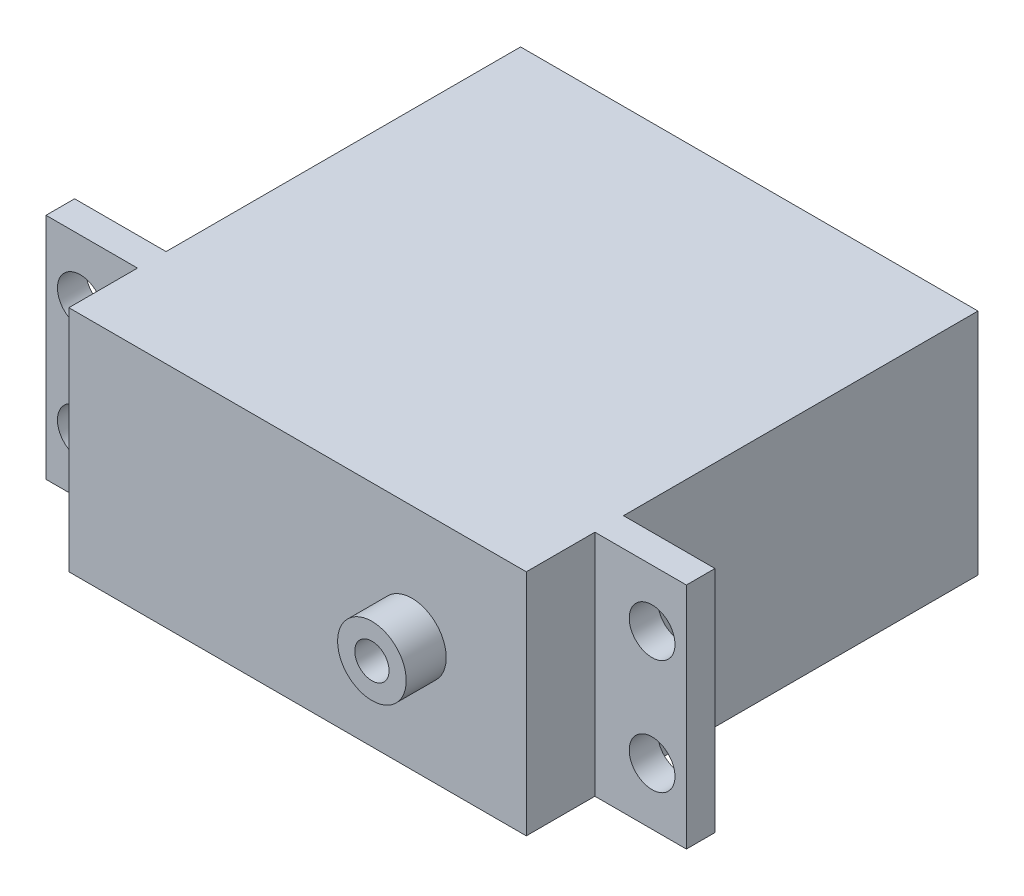
ISO-10303-21;
HEADER;
FILE_DESCRIPTION(('STEP AP214'),'2;1');
FILE_NAME('part.step','',(''),(''),'','','');
FILE_SCHEMA(('AUTOMOTIVE_DESIGN { 1 0 10303 214 1 1 1 1 }'));
ENDSEC;
DATA;
#1=APPLICATION_CONTEXT('core data for automotive mechanical design processes');
#2=APPLICATION_PROTOCOL_DEFINITION('international standard','automotive_design',2000,#1);
#3=PRODUCT_CONTEXT('',#1,'mechanical');
#4=PRODUCT('Part','Part','',(#3));
#5=PRODUCT_RELATED_PRODUCT_CATEGORY('part','',(#4));
#6=PRODUCT_DEFINITION_FORMATION('','',#4);
#7=PRODUCT_DEFINITION_CONTEXT('part definition',#1,'design');
#8=PRODUCT_DEFINITION('design','',#6,#7);
#9=PRODUCT_DEFINITION_SHAPE('','',#8);
#10=(LENGTH_UNIT() NAMED_UNIT(*) SI_UNIT(.MILLI.,.METRE.));
#11=(NAMED_UNIT(*) PLANE_ANGLE_UNIT() SI_UNIT($,.RADIAN.));
#12=(NAMED_UNIT(*) SI_UNIT($,.STERADIAN.) SOLID_ANGLE_UNIT());
#13=UNCERTAINTY_MEASURE_WITH_UNIT(LENGTH_MEASURE(1.E-05),#10,'distance_accuracy_value','');
#14=(GEOMETRIC_REPRESENTATION_CONTEXT(3) GLOBAL_UNCERTAINTY_ASSIGNED_CONTEXT((#13)) GLOBAL_UNIT_ASSIGNED_CONTEXT((#10,
#11,#12)) REPRESENTATION_CONTEXT('',''));
#15=CARTESIAN_POINT('',(0.,0.,0.));
#16=DIRECTION('',(0.,0.,1.));
#17=DIRECTION('',(1.,0.,0.));
#18=AXIS2_PLACEMENT_3D('',#15,#16,#17);
#19=CARTESIAN_POINT('',(20.,-10.,39.5));
#20=DIRECTION('',(-1.,0.,0.));
#21=DIRECTION('',(0.,0.,1.));
#22=AXIS2_PLACEMENT_3D('',#19,#20,#21);
#23=PLANE('',#22);
#24=DIRECTION('',(0.,-1.,0.));
#25=VECTOR('',#24,1.);
#26=CARTESIAN_POINT('',(20.,-10.,33.5));
#27=LINE('',#26,#25);
#28=CARTESIAN_POINT('',(20.,10.,33.5));
#29=VERTEX_POINT('',#28);
#30=CARTESIAN_POINT('',(20.,-10.,33.5));
#31=VERTEX_POINT('',#30);
#32=EDGE_CURVE('E59',#29,#31,#27,.T.);
#33=ORIENTED_EDGE('',*,*,#32,.F.);
#34=DIRECTION('',(0.,0.,-1.));
#35=VECTOR('',#34,1.);
#36=CARTESIAN_POINT('',(20.,10.,39.5));
#37=LINE('',#36,#35);
#38=CARTESIAN_POINT('',(20.,10.,39.5));
#39=VERTEX_POINT('',#38);
#40=EDGE_CURVE('E44',#39,#29,#37,.T.);
#41=ORIENTED_EDGE('',*,*,#40,.F.);
#42=DIRECTION('',(0.,1.,0.));
#43=VECTOR('',#42,1.);
#44=CARTESIAN_POINT('',(20.,-10.,39.5));
#45=LINE('',#44,#43);
#46=CARTESIAN_POINT('',(20.,-10.,39.5));
#47=VERTEX_POINT('',#46);
#48=EDGE_CURVE('E197',#47,#39,#45,.T.);
#49=ORIENTED_EDGE('',*,*,#48,.F.);
#50=DIRECTION('',(0.,0.,-1.));
#51=VECTOR('',#50,1.);
#52=CARTESIAN_POINT('',(20.,-10.,39.5));
#53=LINE('',#52,#51);
#54=EDGE_CURVE('E217',#47,#31,#53,.T.);
#55=ORIENTED_EDGE('',*,*,#54,.T.);
#56=EDGE_LOOP('',(#33,#41,#49,#55));
#57=FACE_BOUND('',#56,.T.);
#58=ADVANCED_FACE('F36',(#57),#23,.F.);
#59=CARTESIAN_POINT('',(-20.,-10.,39.5));
#60=DIRECTION('',(1.,0.,0.));
#61=DIRECTION('',(0.,0.,-1.));
#62=AXIS2_PLACEMENT_3D('',#59,#60,#61);
#63=PLANE('',#62);
#64=DIRECTION('',(0.,1.,0.));
#65=VECTOR('',#64,1.);
#66=CARTESIAN_POINT('',(-20.,-10.,33.5));
#67=LINE('',#66,#65);
#68=CARTESIAN_POINT('',(-20.,-10.,33.5));
#69=VERTEX_POINT('',#68);
#70=CARTESIAN_POINT('',(-20.,10.,33.5));
#71=VERTEX_POINT('',#70);
#72=EDGE_CURVE('E176',#69,#71,#67,.T.);
#73=ORIENTED_EDGE('',*,*,#72,.F.);
#74=DIRECTION('',(0.,0.,-1.));
#75=VECTOR('',#74,1.);
#76=CARTESIAN_POINT('',(-20.,-10.,39.5));
#77=LINE('',#76,#75);
#78=CARTESIAN_POINT('',(-20.,-10.,39.5));
#79=VERTEX_POINT('',#78);
#80=EDGE_CURVE('E220',#79,#69,#77,.T.);
#81=ORIENTED_EDGE('',*,*,#80,.F.);
#82=DIRECTION('',(0.,-1.,0.));
#83=VECTOR('',#82,1.);
#84=CARTESIAN_POINT('',(-20.,-10.,39.5));
#85=LINE('',#84,#83);
#86=CARTESIAN_POINT('',(-20.,10.,39.5));
#87=VERTEX_POINT('',#86);
#88=EDGE_CURVE('E203',#87,#79,#85,.T.);
#89=ORIENTED_EDGE('',*,*,#88,.F.);
#90=DIRECTION('',(0.,0.,-1.));
#91=VECTOR('',#90,1.);
#92=CARTESIAN_POINT('',(-20.,10.,39.5));
#93=LINE('',#92,#91);
#94=EDGE_CURVE('E224',#87,#71,#93,.T.);
#95=ORIENTED_EDGE('',*,*,#94,.T.);
#96=EDGE_LOOP('',(#73,#81,#89,#95));
#97=FACE_BOUND('',#96,.T.);
#98=ADVANCED_FACE('F254',(#97),#63,.F.);
#99=CARTESIAN_POINT('',(20.,10.,31.));
#100=VERTEX_POINT('',#99);
#101=CARTESIAN_POINT('',(20.,10.,0.));
#102=VERTEX_POINT('',#101);
#103=EDGE_CURVE('E51',#100,#102,#37,.T.);
#104=ORIENTED_EDGE('',*,*,#103,.F.);
#105=DIRECTION('',(0.,-1.,0.));
#106=VECTOR('',#105,1.);
#107=CARTESIAN_POINT('',(20.,-10.,31.));
#108=LINE('',#107,#106);
#109=CARTESIAN_POINT('',(20.,-10.,31.));
#110=VERTEX_POINT('',#109);
#111=EDGE_CURVE('E145',#100,#110,#108,.T.);
#112=ORIENTED_EDGE('',*,*,#111,.T.);
#113=CARTESIAN_POINT('',(20.,-10.,0.));
#114=VERTEX_POINT('',#113);
#115=EDGE_CURVE('E207',#110,#114,#53,.T.);
#116=ORIENTED_EDGE('',*,*,#115,.T.);
#117=DIRECTION('',(0.,1.,0.));
#118=VECTOR('',#117,1.);
#119=CARTESIAN_POINT('',(20.,-10.,0.));
#120=LINE('',#119,#118);
#121=EDGE_CURVE('E196',#114,#102,#120,.T.);
#122=ORIENTED_EDGE('',*,*,#121,.T.);
#123=EDGE_LOOP('',(#104,#112,#116,#122));
#124=FACE_BOUND('',#123,.T.);
#125=ADVANCED_FACE('F38',(#124),#23,.F.);
#126=CARTESIAN_POINT('',(-20.,10.,39.5));
#127=DIRECTION('',(0.,-1.,0.));
#128=DIRECTION('',(0.,0.,-1.));
#129=AXIS2_PLACEMENT_3D('',#126,#127,#128);
#130=PLANE('',#129);
#131=CARTESIAN_POINT('',(-20.,10.,31.));
#132=VERTEX_POINT('',#131);
#133=CARTESIAN_POINT('',(-20.,10.,0.));
#134=VERTEX_POINT('',#133);
#135=EDGE_CURVE('E223',#132,#134,#93,.T.);
#136=ORIENTED_EDGE('',*,*,#135,.F.);
#137=DIRECTION('',(-1.,0.,0.));
#138=VECTOR('',#137,1.);
#139=CARTESIAN_POINT('',(-28.,10.,31.));
#140=LINE('',#139,#138);
#141=CARTESIAN_POINT('',(-28.,10.,31.));
#142=VERTEX_POINT('',#141);
#143=EDGE_CURVE('E147',#132,#142,#140,.T.);
#144=ORIENTED_EDGE('',*,*,#143,.T.);
#145=DIRECTION('',(0.,0.,1.));
#146=VECTOR('',#145,1.);
#147=CARTESIAN_POINT('',(-28.,10.,31.));
#148=LINE('',#147,#146);
#149=CARTESIAN_POINT('',(-28.,10.,33.5));
#150=VERTEX_POINT('',#149);
#151=EDGE_CURVE('E137',#142,#150,#148,.T.);
#152=ORIENTED_EDGE('',*,*,#151,.T.);
#153=DIRECTION('',(-1.,0.,0.));
#154=VECTOR('',#153,1.);
#155=CARTESIAN_POINT('',(-28.,10.,33.5));
#156=LINE('',#155,#154);
#157=EDGE_CURVE('E169',#71,#150,#156,.T.);
#158=ORIENTED_EDGE('',*,*,#157,.F.);
#159=ORIENTED_EDGE('',*,*,#94,.F.);
#160=DIRECTION('',(-1.,0.,0.));
#161=VECTOR('',#160,1.);
#162=CARTESIAN_POINT('',(-20.,10.,39.5));
#163=LINE('',#162,#161);
#164=EDGE_CURVE('E200',#39,#87,#163,.T.);
#165=ORIENTED_EDGE('',*,*,#164,.F.);
#166=ORIENTED_EDGE('',*,*,#40,.T.);
#167=CARTESIAN_POINT('',(28.,10.,33.5));
#168=VERTEX_POINT('',#167);
#169=EDGE_CURVE('E132',#168,#29,#156,.T.);
#170=ORIENTED_EDGE('',*,*,#169,.F.);
#171=DIRECTION('',(0.,0.,1.));
#172=VECTOR('',#171,1.);
#173=CARTESIAN_POINT('',(28.,10.,31.));
#174=LINE('',#173,#172);
#175=CARTESIAN_POINT('',(28.,10.,31.));
#176=VERTEX_POINT('',#175);
#177=EDGE_CURVE('E126',#176,#168,#174,.T.);
#178=ORIENTED_EDGE('',*,*,#177,.F.);
#179=EDGE_CURVE('E130',#176,#100,#140,.T.);
#180=ORIENTED_EDGE('',*,*,#179,.T.);
#181=ORIENTED_EDGE('',*,*,#103,.T.);
#182=DIRECTION('',(-1.,0.,0.));
#183=VECTOR('',#182,1.);
#184=CARTESIAN_POINT('',(-20.,10.,0.));
#185=LINE('',#184,#183);
#186=EDGE_CURVE('E209',#102,#134,#185,.T.);
#187=ORIENTED_EDGE('',*,*,#186,.T.);
#188=EDGE_LOOP('',(#136,#144,#152,#158,#159,#165,#166,#170,#178,#180,#181,#187));
#189=FACE_BOUND('',#188,.T.);
#190=ADVANCED_FACE('F129',(#189),#130,.F.);
#191=CARTESIAN_POINT('',(-20.,-10.,31.));
#192=VERTEX_POINT('',#191);
#193=CARTESIAN_POINT('',(-20.,-10.,0.));
#194=VERTEX_POINT('',#193);
#195=EDGE_CURVE('E219',#192,#194,#77,.T.);
#196=ORIENTED_EDGE('',*,*,#195,.F.);
#197=DIRECTION('',(0.,1.,0.));
#198=VECTOR('',#197,1.);
#199=CARTESIAN_POINT('',(-20.,-10.,31.));
#200=LINE('',#199,#198);
#201=EDGE_CURVE('E184',#192,#132,#200,.T.);
#202=ORIENTED_EDGE('',*,*,#201,.T.);
#203=ORIENTED_EDGE('',*,*,#135,.T.);
#204=DIRECTION('',(0.,-1.,0.));
#205=VECTOR('',#204,1.);
#206=CARTESIAN_POINT('',(-20.,-10.,0.));
#207=LINE('',#206,#205);
#208=EDGE_CURVE('E212',#134,#194,#207,.T.);
#209=ORIENTED_EDGE('',*,*,#208,.T.);
#210=EDGE_LOOP('',(#196,#202,#203,#209));
#211=FACE_BOUND('',#210,.T.);
#212=ADVANCED_FACE('F237',(#211),#63,.F.);
#213=CARTESIAN_POINT('',(-20.,-10.,39.5));
#214=DIRECTION('',(0.,1.,0.));
#215=DIRECTION('',(0.,0.,1.));
#216=AXIS2_PLACEMENT_3D('',#213,#214,#215);
#217=PLANE('',#216);
#218=ORIENTED_EDGE('',*,*,#115,.F.);
#219=DIRECTION('',(1.,0.,0.));
#220=VECTOR('',#219,1.);
#221=CARTESIAN_POINT('',(-28.,-10.,31.));
#222=LINE('',#221,#220);
#223=CARTESIAN_POINT('',(28.,-10.,31.));
#224=VERTEX_POINT('',#223);
#225=EDGE_CURVE('E164',#110,#224,#222,.T.);
#226=ORIENTED_EDGE('',*,*,#225,.T.);
#227=DIRECTION('',(0.,0.,1.));
#228=VECTOR('',#227,1.);
#229=CARTESIAN_POINT('',(28.,-10.,31.));
#230=LINE('',#229,#228);
#231=CARTESIAN_POINT('',(28.,-10.,33.5));
#232=VERTEX_POINT('',#231);
#233=EDGE_CURVE('E152',#224,#232,#230,.T.);
#234=ORIENTED_EDGE('',*,*,#233,.T.);
#235=DIRECTION('',(1.,0.,0.));
#236=VECTOR('',#235,1.);
#237=CARTESIAN_POINT('',(-28.,-10.,33.5));
#238=LINE('',#237,#236);
#239=EDGE_CURVE('E156',#31,#232,#238,.T.);
#240=ORIENTED_EDGE('',*,*,#239,.F.);
#241=ORIENTED_EDGE('',*,*,#54,.F.);
#242=DIRECTION('',(1.,0.,0.));
#243=VECTOR('',#242,1.);
#244=CARTESIAN_POINT('',(-20.,-10.,39.5));
#245=LINE('',#244,#243);
#246=EDGE_CURVE('E205',#79,#47,#245,.T.);
#247=ORIENTED_EDGE('',*,*,#246,.F.);
#248=ORIENTED_EDGE('',*,*,#80,.T.);
#249=CARTESIAN_POINT('',(-28.,-10.,33.5));
#250=VERTEX_POINT('',#249);
#251=EDGE_CURVE('E153',#250,#69,#238,.T.);
#252=ORIENTED_EDGE('',*,*,#251,.F.);
#253=DIRECTION('',(0.,0.,1.));
#254=VECTOR('',#253,1.);
#255=CARTESIAN_POINT('',(-28.,-10.,31.));
#256=LINE('',#255,#254);
#257=CARTESIAN_POINT('',(-28.,-10.,31.));
#258=VERTEX_POINT('',#257);
#259=EDGE_CURVE('E177',#258,#250,#256,.T.);
#260=ORIENTED_EDGE('',*,*,#259,.F.);
#261=EDGE_CURVE('E138',#258,#192,#222,.T.);
#262=ORIENTED_EDGE('',*,*,#261,.T.);
#263=ORIENTED_EDGE('',*,*,#195,.T.);
#264=DIRECTION('',(1.,0.,0.));
#265=VECTOR('',#264,1.);
#266=CARTESIAN_POINT('',(-20.,-10.,0.));
#267=LINE('',#266,#265);
#268=EDGE_CURVE('E201',#194,#114,#267,.T.);
#269=ORIENTED_EDGE('',*,*,#268,.T.);
#270=EDGE_LOOP('',(#218,#226,#234,#240,#241,#247,#248,#252,#260,#262,#263,#269));
#271=FACE_BOUND('',#270,.T.);
#272=ADVANCED_FACE('F233',(#271),#217,.F.);
#273=CARTESIAN_POINT('',(0.,0.,39.5));
#274=DIRECTION('',(0.,0.,-1.));
#275=DIRECTION('',(-1.,0.,0.));
#276=AXIS2_PLACEMENT_3D('',#273,#274,#275);
#277=PLANE('',#276);
#278=CARTESIAN_POINT('',(10.,0.,39.5));
#279=DIRECTION('',(0.,0.,-1.));
#280=DIRECTION('',(-1.,0.,0.));
#281=AXIS2_PLACEMENT_3D('',#278,#279,#280);
#282=CIRCLE('',#281,3.);
#283=CARTESIAN_POINT('',(7.,0.,39.5));
#284=VERTEX_POINT('',#283);
#285=EDGE_CURVE('E11',#284,#284,#282,.F.);
#286=ORIENTED_EDGE('',*,*,#285,.F.);
#287=EDGE_LOOP('',(#286));
#288=FACE_BOUND('',#287,.T.);
#289=ORIENTED_EDGE('',*,*,#48,.T.);
#290=ORIENTED_EDGE('',*,*,#164,.T.);
#291=ORIENTED_EDGE('',*,*,#88,.T.);
#292=ORIENTED_EDGE('',*,*,#246,.T.);
#293=EDGE_LOOP('',(#289,#290,#291,#292));
#294=FACE_BOUND('',#293,.T.);
#295=ADVANCED_FACE('F260',(#288,#294),#277,.F.);
#296=CARTESIAN_POINT('',(0.,0.,0.));
#297=DIRECTION('',(0.,0.,-1.));
#298=DIRECTION('',(-1.,0.,0.));
#299=AXIS2_PLACEMENT_3D('',#296,#297,#298);
#300=PLANE('',#299);
#301=ORIENTED_EDGE('',*,*,#121,.F.);
#302=ORIENTED_EDGE('',*,*,#268,.F.);
#303=ORIENTED_EDGE('',*,*,#208,.F.);
#304=ORIENTED_EDGE('',*,*,#186,.F.);
#305=EDGE_LOOP('',(#301,#302,#303,#304));
#306=FACE_BOUND('',#305,.T.);
#307=ADVANCED_FACE('F229',(#306),#300,.T.);
#308=CARTESIAN_POINT('',(10.,0.,43.));
#309=DIRECTION('',(0.,0.,1.));
#310=DIRECTION('',(1.,0.,0.));
#311=AXIS2_PLACEMENT_3D('',#308,#309,#310);
#312=PLANE('',#311);
#313=CARTESIAN_POINT('',(10.,0.,43.));
#314=DIRECTION('',(0.,0.,1.));
#315=DIRECTION('',(1.,0.,0.));
#316=AXIS2_PLACEMENT_3D('',#313,#314,#315);
#317=CIRCLE('',#316,3.);
#318=CARTESIAN_POINT('',(13.,0.,43.));
#319=VERTEX_POINT('',#318);
#320=EDGE_CURVE('E191',#319,#319,#317,.T.);
#321=ORIENTED_EDGE('',*,*,#320,.T.);
#322=EDGE_LOOP('',(#321));
#323=FACE_BOUND('',#322,.T.);
#324=CARTESIAN_POINT('',(10.,0.,43.));
#325=DIRECTION('',(0.,0.,1.));
#326=DIRECTION('',(1.,0.,0.));
#327=AXIS2_PLACEMENT_3D('',#324,#325,#326);
#328=CIRCLE('',#327,1.5);
#329=CARTESIAN_POINT('',(11.5,0.,43.));
#330=VERTEX_POINT('',#329);
#331=EDGE_CURVE('E188',#330,#330,#328,.T.);
#332=ORIENTED_EDGE('',*,*,#331,.F.);
#333=EDGE_LOOP('',(#332));
#334=FACE_BOUND('',#333,.T.);
#335=ADVANCED_FACE('F278',(#323,#334),#312,.T.);
#336=CARTESIAN_POINT('',(10.,0.,43.));
#337=DIRECTION('',(0.,0.,-1.));
#338=DIRECTION('',(-1.,0.,0.));
#339=AXIS2_PLACEMENT_3D('',#336,#337,#338);
#340=CYLINDRICAL_SURFACE('',#339,3.);
#341=ORIENTED_EDGE('',*,*,#320,.F.);
#342=EDGE_LOOP('',(#341));
#343=FACE_BOUND('',#342,.T.);
#344=ORIENTED_EDGE('',*,*,#285,.T.);
#345=EDGE_LOOP('',(#344));
#346=FACE_BOUND('',#345,.T.);
#347=ADVANCED_FACE('F283',(#343,#346),#340,.T.);
#348=CARTESIAN_POINT('',(10.,0.,43.));
#349=DIRECTION('',(0.,0.,-1.));
#350=DIRECTION('',(-1.,0.,0.));
#351=AXIS2_PLACEMENT_3D('',#348,#349,#350);
#352=CYLINDRICAL_SURFACE('',#351,1.5);
#353=ORIENTED_EDGE('',*,*,#331,.T.);
#354=EDGE_LOOP('',(#353));
#355=FACE_BOUND('',#354,.T.);
#356=CARTESIAN_POINT('',(10.,0.,39.5));
#357=DIRECTION('',(0.,0.,1.));
#358=DIRECTION('',(1.,0.,0.));
#359=AXIS2_PLACEMENT_3D('',#356,#357,#358);
#360=CIRCLE('',#359,1.5);
#361=CARTESIAN_POINT('',(11.5,0.,39.5));
#362=VERTEX_POINT('',#361);
#363=EDGE_CURVE('E187',#362,#362,#360,.T.);
#364=ORIENTED_EDGE('',*,*,#363,.F.);
#365=EDGE_LOOP('',(#364));
#366=FACE_BOUND('',#365,.T.);
#367=ADVANCED_FACE('F286',(#355,#366),#352,.F.);
#368=ORIENTED_EDGE('',*,*,#363,.T.);
#369=EDGE_LOOP('',(#368));
#370=FACE_BOUND('',#369,.T.);
#371=ADVANCED_FACE('F282',(#370),#277,.F.);
#372=CARTESIAN_POINT('',(-28.,-10.,31.));
#373=DIRECTION('',(-1.,0.,0.));
#374=DIRECTION('',(0.,0.,1.));
#375=AXIS2_PLACEMENT_3D('',#372,#373,#374);
#376=PLANE('',#375);
#377=DIRECTION('',(0.,-1.,0.));
#378=VECTOR('',#377,1.);
#379=CARTESIAN_POINT('',(-28.,-10.,33.5));
#380=LINE('',#379,#378);
#381=EDGE_CURVE('E172',#150,#250,#380,.T.);
#382=ORIENTED_EDGE('',*,*,#381,.F.);
#383=ORIENTED_EDGE('',*,*,#151,.F.);
#384=DIRECTION('',(0.,-1.,0.));
#385=VECTOR('',#384,1.);
#386=CARTESIAN_POINT('',(-28.,-10.,31.));
#387=LINE('',#386,#385);
#388=EDGE_CURVE('E146',#142,#258,#387,.T.);
#389=ORIENTED_EDGE('',*,*,#388,.T.);
#390=ORIENTED_EDGE('',*,*,#259,.T.);
#391=EDGE_LOOP('',(#382,#383,#389,#390));
#392=FACE_BOUND('',#391,.T.);
#393=ADVANCED_FACE('F245',(#392),#376,.T.);
#394=CARTESIAN_POINT('',(-25.,-5.,31.));
#395=DIRECTION('',(0.,0.,1.));
#396=DIRECTION('',(1.,0.,0.));
#397=AXIS2_PLACEMENT_3D('',#394,#395,#396);
#398=CYLINDRICAL_SURFACE('',#397,2.);
#399=CARTESIAN_POINT('',(-25.,-5.,31.));
#400=DIRECTION('',(0.,0.,1.));
#401=DIRECTION('',(1.,0.,0.));
#402=AXIS2_PLACEMENT_3D('',#399,#400,#401);
#403=CIRCLE('',#402,2.);
#404=CARTESIAN_POINT('',(-23.,-5.,31.));
#405=VERTEX_POINT('',#404);
#406=EDGE_CURVE('E325',#405,#405,#403,.T.);
#407=ORIENTED_EDGE('',*,*,#406,.F.);
#408=EDGE_LOOP('',(#407));
#409=FACE_BOUND('',#408,.T.);
#410=CARTESIAN_POINT('',(-25.,-5.,33.5));
#411=DIRECTION('',(0.,0.,1.));
#412=DIRECTION('',(1.,0.,0.));
#413=AXIS2_PLACEMENT_3D('',#410,#411,#412);
#414=CIRCLE('',#413,2.);
#415=CARTESIAN_POINT('',(-23.,-5.,33.5));
#416=VERTEX_POINT('',#415);
#417=EDGE_CURVE('E328',#416,#416,#414,.T.);
#418=ORIENTED_EDGE('',*,*,#417,.T.);
#419=EDGE_LOOP('',(#418));
#420=FACE_BOUND('',#419,.T.);
#421=ADVANCED_FACE('F300',(#409,#420),#398,.F.);
#422=CARTESIAN_POINT('',(-25.,5.,31.));
#423=DIRECTION('',(0.,0.,1.));
#424=DIRECTION('',(1.,0.,0.));
#425=AXIS2_PLACEMENT_3D('',#422,#423,#424);
#426=CYLINDRICAL_SURFACE('',#425,2.);
#427=CARTESIAN_POINT('',(-25.,5.,31.));
#428=DIRECTION('',(0.,0.,1.));
#429=DIRECTION('',(1.,0.,0.));
#430=AXIS2_PLACEMENT_3D('',#427,#428,#429);
#431=CIRCLE('',#430,2.);
#432=CARTESIAN_POINT('',(-23.,5.,31.));
#433=VERTEX_POINT('',#432);
#434=EDGE_CURVE('E334',#433,#433,#431,.T.);
#435=ORIENTED_EDGE('',*,*,#434,.F.);
#436=EDGE_LOOP('',(#435));
#437=FACE_BOUND('',#436,.T.);
#438=CARTESIAN_POINT('',(-25.,5.,33.5));
#439=DIRECTION('',(0.,0.,1.));
#440=DIRECTION('',(1.,0.,0.));
#441=AXIS2_PLACEMENT_3D('',#438,#439,#440);
#442=CIRCLE('',#441,2.);
#443=CARTESIAN_POINT('',(-23.,5.,33.5));
#444=VERTEX_POINT('',#443);
#445=EDGE_CURVE('E331',#444,#444,#442,.T.);
#446=ORIENTED_EDGE('',*,*,#445,.T.);
#447=EDGE_LOOP('',(#446));
#448=FACE_BOUND('',#447,.T.);
#449=ADVANCED_FACE('F314',(#437,#448),#426,.F.);
#450=CARTESIAN_POINT('',(0.,0.,33.5));
#451=DIRECTION('',(0.,0.,-1.));
#452=DIRECTION('',(-1.,0.,0.));
#453=AXIS2_PLACEMENT_3D('',#450,#451,#452);
#454=PLANE('',#453);
#455=ORIENTED_EDGE('',*,*,#445,.F.);
#456=EDGE_LOOP('',(#455));
#457=FACE_BOUND('',#456,.T.);
#458=ORIENTED_EDGE('',*,*,#417,.F.);
#459=EDGE_LOOP('',(#458));
#460=FACE_BOUND('',#459,.T.);
#461=ORIENTED_EDGE('',*,*,#251,.T.);
#462=ORIENTED_EDGE('',*,*,#72,.T.);
#463=ORIENTED_EDGE('',*,*,#157,.T.);
#464=ORIENTED_EDGE('',*,*,#381,.T.);
#465=EDGE_LOOP('',(#461,#462,#463,#464));
#466=FACE_BOUND('',#465,.T.);
#467=ADVANCED_FACE('F250',(#457,#460,#466),#454,.F.);
#468=CARTESIAN_POINT('',(0.,0.,31.));
#469=DIRECTION('',(0.,0.,-1.));
#470=DIRECTION('',(-1.,0.,0.));
#471=AXIS2_PLACEMENT_3D('',#468,#469,#470);
#472=PLANE('',#471);
#473=ORIENTED_EDGE('',*,*,#434,.T.);
#474=EDGE_LOOP('',(#473));
#475=FACE_BOUND('',#474,.T.);
#476=ORIENTED_EDGE('',*,*,#406,.T.);
#477=EDGE_LOOP('',(#476));
#478=FACE_BOUND('',#477,.T.);
#479=ORIENTED_EDGE('',*,*,#201,.F.);
#480=ORIENTED_EDGE('',*,*,#261,.F.);
#481=ORIENTED_EDGE('',*,*,#388,.F.);
#482=ORIENTED_EDGE('',*,*,#143,.F.);
#483=EDGE_LOOP('',(#479,#480,#481,#482));
#484=FACE_BOUND('',#483,.T.);
#485=ADVANCED_FACE('F242',(#475,#478,#484),#472,.T.);
#486=CARTESIAN_POINT('',(25.,5.,31.));
#487=DIRECTION('',(0.,0.,1.));
#488=DIRECTION('',(1.,0.,0.));
#489=AXIS2_PLACEMENT_3D('',#486,#487,#488);
#490=CIRCLE('',#489,2.);
#491=CARTESIAN_POINT('',(27.,5.,31.));
#492=VERTEX_POINT('',#491);
#493=EDGE_CURVE('E170',#492,#492,#490,.T.);
#494=ORIENTED_EDGE('',*,*,#493,.T.);
#495=EDGE_LOOP('',(#494));
#496=FACE_BOUND('',#495,.T.);
#497=CARTESIAN_POINT('',(25.,-5.,31.));
#498=DIRECTION('',(0.,0.,1.));
#499=DIRECTION('',(1.,0.,0.));
#500=AXIS2_PLACEMENT_3D('',#497,#498,#499);
#501=CIRCLE('',#500,2.);
#502=CARTESIAN_POINT('',(27.,-5.,31.));
#503=VERTEX_POINT('',#502);
#504=EDGE_CURVE('E340',#503,#503,#501,.T.);
#505=ORIENTED_EDGE('',*,*,#504,.T.);
#506=EDGE_LOOP('',(#505));
#507=FACE_BOUND('',#506,.T.);
#508=ORIENTED_EDGE('',*,*,#111,.F.);
#509=ORIENTED_EDGE('',*,*,#179,.F.);
#510=DIRECTION('',(0.,1.,0.));
#511=VECTOR('',#510,1.);
#512=CARTESIAN_POINT('',(28.,-10.,31.));
#513=LINE('',#512,#511);
#514=EDGE_CURVE('E144',#224,#176,#513,.T.);
#515=ORIENTED_EDGE('',*,*,#514,.F.);
#516=ORIENTED_EDGE('',*,*,#225,.F.);
#517=EDGE_LOOP('',(#508,#509,#515,#516));
#518=FACE_BOUND('',#517,.T.);
#519=ADVANCED_FACE('F142',(#496,#507,#518),#472,.T.);
#520=CARTESIAN_POINT('',(25.,-5.,33.5));
#521=DIRECTION('',(0.,0.,1.));
#522=DIRECTION('',(1.,0.,0.));
#523=AXIS2_PLACEMENT_3D('',#520,#521,#522);
#524=CIRCLE('',#523,2.);
#525=CARTESIAN_POINT('',(27.,-5.,33.5));
#526=VERTEX_POINT('',#525);
#527=EDGE_CURVE('E337',#526,#526,#524,.T.);
#528=ORIENTED_EDGE('',*,*,#527,.F.);
#529=EDGE_LOOP('',(#528));
#530=FACE_BOUND('',#529,.T.);
#531=CARTESIAN_POINT('',(25.,5.,33.5));
#532=DIRECTION('',(0.,0.,1.));
#533=DIRECTION('',(1.,0.,0.));
#534=AXIS2_PLACEMENT_3D('',#531,#532,#533);
#535=CIRCLE('',#534,2.);
#536=CARTESIAN_POINT('',(27.,5.,33.5));
#537=VERTEX_POINT('',#536);
#538=EDGE_CURVE('E159',#537,#537,#535,.T.);
#539=ORIENTED_EDGE('',*,*,#538,.F.);
#540=EDGE_LOOP('',(#539));
#541=FACE_BOUND('',#540,.T.);
#542=ORIENTED_EDGE('',*,*,#169,.T.);
#543=ORIENTED_EDGE('',*,*,#32,.T.);
#544=ORIENTED_EDGE('',*,*,#239,.T.);
#545=DIRECTION('',(0.,1.,0.));
#546=VECTOR('',#545,1.);
#547=CARTESIAN_POINT('',(28.,-10.,33.5));
#548=LINE('',#547,#546);
#549=EDGE_CURVE('E167',#232,#168,#548,.T.);
#550=ORIENTED_EDGE('',*,*,#549,.T.);
#551=EDGE_LOOP('',(#542,#543,#544,#550));
#552=FACE_BOUND('',#551,.T.);
#553=ADVANCED_FACE('F297',(#530,#541,#552),#454,.F.);
#554=CARTESIAN_POINT('',(28.,-10.,31.));
#555=DIRECTION('',(1.,0.,0.));
#556=DIRECTION('',(0.,0.,-1.));
#557=AXIS2_PLACEMENT_3D('',#554,#555,#556);
#558=PLANE('',#557);
#559=ORIENTED_EDGE('',*,*,#549,.F.);
#560=ORIENTED_EDGE('',*,*,#233,.F.);
#561=ORIENTED_EDGE('',*,*,#514,.T.);
#562=ORIENTED_EDGE('',*,*,#177,.T.);
#563=EDGE_LOOP('',(#559,#560,#561,#562));
#564=FACE_BOUND('',#563,.T.);
#565=ADVANCED_FACE('F150',(#564),#558,.T.);
#566=CARTESIAN_POINT('',(25.,5.,31.));
#567=DIRECTION('',(0.,0.,1.));
#568=DIRECTION('',(1.,0.,0.));
#569=AXIS2_PLACEMENT_3D('',#566,#567,#568);
#570=CYLINDRICAL_SURFACE('',#569,2.);
#571=ORIENTED_EDGE('',*,*,#493,.F.);
#572=EDGE_LOOP('',(#571));
#573=FACE_BOUND('',#572,.T.);
#574=ORIENTED_EDGE('',*,*,#538,.T.);
#575=EDGE_LOOP('',(#574));
#576=FACE_BOUND('',#575,.T.);
#577=ADVANCED_FACE('F296',(#573,#576),#570,.F.);
#578=CARTESIAN_POINT('',(25.,-5.,31.));
#579=DIRECTION('',(0.,0.,1.));
#580=DIRECTION('',(1.,0.,0.));
#581=AXIS2_PLACEMENT_3D('',#578,#579,#580);
#582=CYLINDRICAL_SURFACE('',#581,2.);
#583=ORIENTED_EDGE('',*,*,#504,.F.);
#584=EDGE_LOOP('',(#583));
#585=FACE_BOUND('',#584,.T.);
#586=ORIENTED_EDGE('',*,*,#527,.T.);
#587=EDGE_LOOP('',(#586));
#588=FACE_BOUND('',#587,.T.);
#589=ADVANCED_FACE('F309',(#585,#588),#582,.F.);
#590=CLOSED_SHELL('',(#58,#98,#125,#190,#212,#272,#295,#307,#335,#347,#367,#371,#393,#421,#449,
#467,#485,#519,#553,#565,#577,#589));
#591=MANIFOLD_SOLID_BREP('B2',#590);
#592=ADVANCED_BREP_SHAPE_REPRESENTATION('',(#18,#591),#14);
#593=SHAPE_DEFINITION_REPRESENTATION(#9,#592);
ENDSEC;
END-ISO-10303-21;
